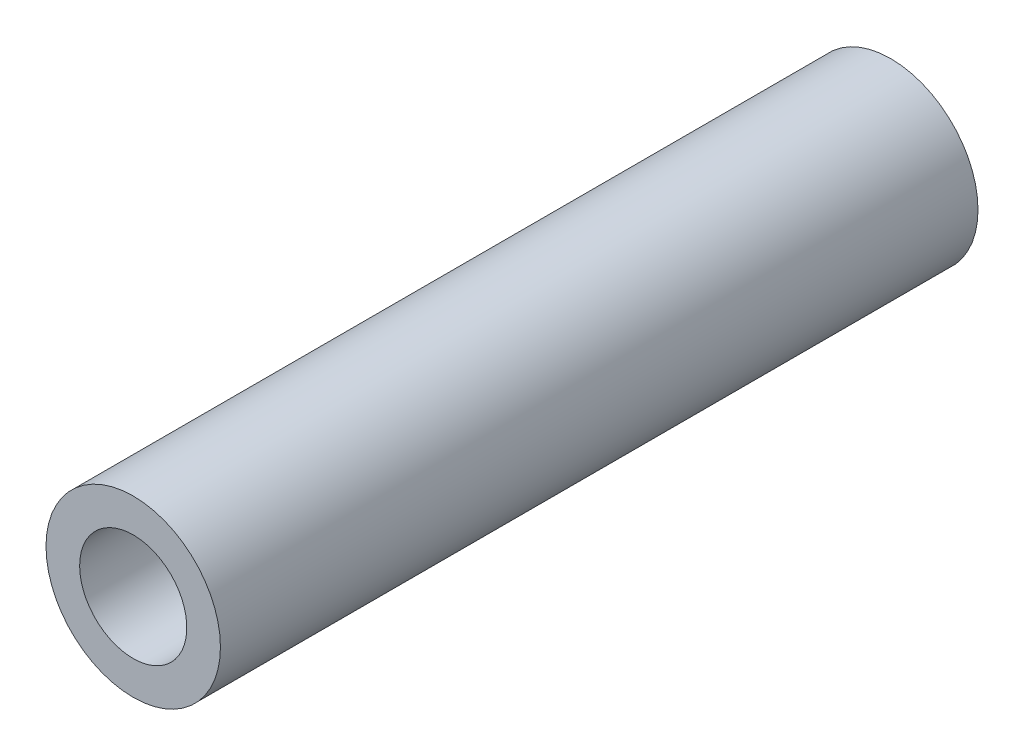
ISO-10303-21;
HEADER;
FILE_DESCRIPTION(('STEP AP214'),'2;1');
FILE_NAME('part.step','',(''),(''),'','','');
FILE_SCHEMA(('AUTOMOTIVE_DESIGN { 1 0 10303 214 1 1 1 1 }'));
ENDSEC;
DATA;
#1=APPLICATION_CONTEXT('core data for automotive mechanical design processes');
#2=APPLICATION_PROTOCOL_DEFINITION('international standard','automotive_design',2000,#1);
#3=PRODUCT_CONTEXT('',#1,'mechanical');
#4=PRODUCT('Part','Part','',(#3));
#5=PRODUCT_RELATED_PRODUCT_CATEGORY('part','',(#4));
#6=PRODUCT_DEFINITION_FORMATION('','',#4);
#7=PRODUCT_DEFINITION_CONTEXT('part definition',#1,'design');
#8=PRODUCT_DEFINITION('design','',#6,#7);
#9=PRODUCT_DEFINITION_SHAPE('','',#8);
#10=(LENGTH_UNIT() NAMED_UNIT(*) SI_UNIT(.MILLI.,.METRE.));
#11=(NAMED_UNIT(*) PLANE_ANGLE_UNIT() SI_UNIT($,.RADIAN.));
#12=(NAMED_UNIT(*) SI_UNIT($,.STERADIAN.) SOLID_ANGLE_UNIT());
#13=UNCERTAINTY_MEASURE_WITH_UNIT(LENGTH_MEASURE(1.E-05),#10,'distance_accuracy_value','');
#14=(GEOMETRIC_REPRESENTATION_CONTEXT(3) GLOBAL_UNCERTAINTY_ASSIGNED_CONTEXT((#13)) GLOBAL_UNIT_ASSIGNED_CONTEXT((#10,
#11,#12)) REPRESENTATION_CONTEXT('',''));
#15=CARTESIAN_POINT('',(0.,0.,0.));
#16=DIRECTION('',(0.,0.,1.));
#17=DIRECTION('',(1.,0.,0.));
#18=AXIS2_PLACEMENT_3D('',#15,#16,#17);
#19=CARTESIAN_POINT('',(0.,0.,30.4));
#20=DIRECTION('',(0.,0.,1.));
#21=DIRECTION('',(1.,0.,0.));
#22=AXIS2_PLACEMENT_3D('',#19,#20,#21);
#23=PLANE('',#22);
#24=CARTESIAN_POINT('',(0.,0.,30.4));
#25=DIRECTION('',(0.,0.,1.));
#26=DIRECTION('',(1.,0.,0.));
#27=AXIS2_PLACEMENT_3D('',#24,#25,#26);
#28=CIRCLE('',#27,3.5);
#29=CARTESIAN_POINT('',(-3.5,0.,30.4));
#30=VERTEX_POINT('',#29);
#31=EDGE_CURVE('E10',#30,#30,#28,.T.);
#32=ORIENTED_EDGE('',*,*,#31,.T.);
#33=EDGE_LOOP('',(#32));
#34=FACE_BOUND('',#33,.T.);
#35=CARTESIAN_POINT('',(0.,0.,30.4));
#36=DIRECTION('',(0.,0.,1.));
#37=DIRECTION('',(1.,0.,0.));
#38=AXIS2_PLACEMENT_3D('',#35,#36,#37);
#39=CIRCLE('',#38,2.15);
#40=CARTESIAN_POINT('',(-2.15,0.,30.4));
#41=VERTEX_POINT('',#40);
#42=EDGE_CURVE('E48',#41,#41,#39,.T.);
#43=ORIENTED_EDGE('',*,*,#42,.F.);
#44=EDGE_LOOP('',(#43));
#45=FACE_BOUND('',#44,.T.);
#46=ADVANCED_FACE('F37',(#34,#45),#23,.T.);
#47=CARTESIAN_POINT('',(0.,0.,0.));
#48=DIRECTION('',(0.,0.,1.));
#49=DIRECTION('',(1.,0.,0.));
#50=AXIS2_PLACEMENT_3D('',#47,#48,#49);
#51=PLANE('',#50);
#52=CARTESIAN_POINT('',(0.,0.,0.));
#53=DIRECTION('',(0.,0.,1.));
#54=DIRECTION('',(1.,0.,0.));
#55=AXIS2_PLACEMENT_3D('',#52,#53,#54);
#56=CIRCLE('',#55,3.5);
#57=CARTESIAN_POINT('',(-3.5,0.,0.));
#58=VERTEX_POINT('',#57);
#59=EDGE_CURVE('E41',#58,#58,#56,.T.);
#60=ORIENTED_EDGE('',*,*,#59,.F.);
#61=EDGE_LOOP('',(#60));
#62=FACE_BOUND('',#61,.T.);
#63=CARTESIAN_POINT('',(0.,0.,0.));
#64=DIRECTION('',(0.,0.,1.));
#65=DIRECTION('',(1.,0.,0.));
#66=AXIS2_PLACEMENT_3D('',#63,#64,#65);
#67=CIRCLE('',#66,2.15);
#68=CARTESIAN_POINT('',(-2.15,0.,0.));
#69=VERTEX_POINT('',#68);
#70=EDGE_CURVE('E50',#69,#69,#67,.T.);
#71=ORIENTED_EDGE('',*,*,#70,.T.);
#72=EDGE_LOOP('',(#71));
#73=FACE_BOUND('',#72,.T.);
#74=ADVANCED_FACE('F60',(#62,#73),#51,.F.);
#75=CARTESIAN_POINT('',(0.,0.,30.4));
#76=DIRECTION('',(0.,0.,-1.));
#77=DIRECTION('',(-1.,0.,0.));
#78=AXIS2_PLACEMENT_3D('',#75,#76,#77);
#79=CYLINDRICAL_SURFACE('',#78,3.5);
#80=CARTESIAN_POINT('',(-3.5,0.,30.4));
#81=CARTESIAN_POINT('',(-3.5,0.,30.0833333333333));
#82=CARTESIAN_POINT('',(-3.5,0.,29.7666666666667));
#83=CARTESIAN_POINT('',(-3.5,0.,29.1333333333333));
#84=CARTESIAN_POINT('',(-3.5,0.,28.8166666666667));
#85=CARTESIAN_POINT('',(-3.5,0.,28.1833333333333));
#86=CARTESIAN_POINT('',(-3.5,0.,27.8666666666667));
#87=CARTESIAN_POINT('',(-3.5,0.,27.2333333333333));
#88=CARTESIAN_POINT('',(-3.5,0.,26.9166666666667));
#89=CARTESIAN_POINT('',(-3.5,0.,26.2833333333333));
#90=CARTESIAN_POINT('',(-3.5,0.,25.9666666666667));
#91=CARTESIAN_POINT('',(-3.5,0.,25.3333333333333));
#92=CARTESIAN_POINT('',(-3.5,0.,25.0166666666667));
#93=CARTESIAN_POINT('',(-3.5,0.,24.3833333333333));
#94=CARTESIAN_POINT('',(-3.5,0.,24.0666666666667));
#95=CARTESIAN_POINT('',(-3.5,0.,23.4333333333333));
#96=CARTESIAN_POINT('',(-3.5,0.,23.1166666666667));
#97=CARTESIAN_POINT('',(-3.5,0.,22.4833333333333));
#98=CARTESIAN_POINT('',(-3.5,0.,22.1666666666667));
#99=CARTESIAN_POINT('',(-3.5,0.,21.5333333333333));
#100=CARTESIAN_POINT('',(-3.5,0.,21.2166666666667));
#101=CARTESIAN_POINT('',(-3.5,0.,20.5833333333333));
#102=CARTESIAN_POINT('',(-3.5,0.,20.2666666666667));
#103=CARTESIAN_POINT('',(-3.5,0.,19.6333333333333));
#104=CARTESIAN_POINT('',(-3.5,0.,19.3166666666667));
#105=CARTESIAN_POINT('',(-3.5,0.,18.6833333333333));
#106=CARTESIAN_POINT('',(-3.5,0.,18.3666666666667));
#107=CARTESIAN_POINT('',(-3.5,0.,17.7333333333333));
#108=CARTESIAN_POINT('',(-3.5,0.,17.4166666666667));
#109=CARTESIAN_POINT('',(-3.5,0.,16.7833333333333));
#110=CARTESIAN_POINT('',(-3.5,0.,16.4666666666667));
#111=CARTESIAN_POINT('',(-3.5,0.,15.8333333333333));
#112=CARTESIAN_POINT('',(-3.5,0.,15.5166666666667));
#113=CARTESIAN_POINT('',(-3.5,0.,14.8833333333333));
#114=CARTESIAN_POINT('',(-3.5,0.,14.5666666666667));
#115=CARTESIAN_POINT('',(-3.5,0.,13.9333333333333));
#116=CARTESIAN_POINT('',(-3.5,0.,13.6166666666667));
#117=CARTESIAN_POINT('',(-3.5,0.,12.9833333333333));
#118=CARTESIAN_POINT('',(-3.5,0.,12.6666666666667));
#119=CARTESIAN_POINT('',(-3.5,0.,12.0333333333333));
#120=CARTESIAN_POINT('',(-3.5,0.,11.7166666666667));
#121=CARTESIAN_POINT('',(-3.5,0.,11.0833333333333));
#122=CARTESIAN_POINT('',(-3.5,0.,10.7666666666667));
#123=CARTESIAN_POINT('',(-3.5,0.,10.1333333333333));
#124=CARTESIAN_POINT('',(-3.5,0.,9.81666666666667));
#125=CARTESIAN_POINT('',(-3.5,0.,9.18333333333334));
#126=CARTESIAN_POINT('',(-3.5,0.,8.86666666666667));
#127=CARTESIAN_POINT('',(-3.5,0.,8.23333333333334));
#128=CARTESIAN_POINT('',(-3.5,0.,7.91666666666667));
#129=CARTESIAN_POINT('',(-3.5,0.,7.28333333333333));
#130=CARTESIAN_POINT('',(-3.5,0.,6.96666666666667));
#131=CARTESIAN_POINT('',(-3.5,0.,6.33333333333333));
#132=CARTESIAN_POINT('',(-3.5,0.,6.01666666666667));
#133=CARTESIAN_POINT('',(-3.5,0.,5.38333333333333));
#134=CARTESIAN_POINT('',(-3.5,0.,5.06666666666667));
#135=CARTESIAN_POINT('',(-3.5,0.,4.43333333333333));
#136=CARTESIAN_POINT('',(-3.5,0.,4.11666666666667));
#137=CARTESIAN_POINT('',(-3.5,0.,3.48333333333333));
#138=CARTESIAN_POINT('',(-3.5,0.,3.16666666666667));
#139=CARTESIAN_POINT('',(-3.5,0.,2.53333333333333));
#140=CARTESIAN_POINT('',(-3.5,0.,2.21666666666667));
#141=CARTESIAN_POINT('',(-3.5,0.,1.58333333333333));
#142=CARTESIAN_POINT('',(-3.5,0.,1.26666666666667));
#143=CARTESIAN_POINT('',(-3.5,0.,0.633333333333333));
#144=CARTESIAN_POINT('',(-3.5,0.,0.316666666666666));
#145=CARTESIAN_POINT('',(-3.5,0.,0.));
#146=B_SPLINE_CURVE_WITH_KNOTS('',3,(#80,#81,#82,#83,#84,#85,#86,#87,#88,#89,#90,#91,#92,#93,
#94,#95,#96,#97,#98,#99,#100,#101,#102,#103,#104,#105,#106,#107,#108,#109,#110,#111,#112,#113,
#114,#115,#116,#117,#118,#119,#120,#121,#122,#123,#124,#125,#126,#127,#128,#129,#130,#131,#132,
#133,#134,#135,#136,#137,#138,#139,#140,#141,#142,#143,#144,#145),.UNSPECIFIED.,.F.,.F.,(4,2,2,
2,2,2,2,2,2,2,2,2,2,2,2,2,2,2,2,2,2,2,2,2,2,2,2,2,2,2,2,2,4),(0.,0.950000000000003,1.9,2.85,3.8,
4.75,5.7,6.65,7.6,8.55,9.5,10.45,11.4,12.35,13.3,14.25,15.2,16.15,17.1,18.05,19.,19.95,20.9,
21.85,22.8,23.75,24.7,25.65,26.6,27.55,28.5,29.45,30.4),.UNSPECIFIED.);
#147=EDGE_CURVE('BSEAM39',#30,#58,#146,.T.);
#148=ORIENTED_EDGE('',*,*,#31,.F.);
#149=ORIENTED_EDGE('',*,*,#59,.T.);
#150=ORIENTED_EDGE('',*,*,#147,.T.);
#151=ORIENTED_EDGE('',*,*,#147,.F.);
#152=EDGE_LOOP('',(#148,#150,#149,#151));
#153=FACE_BOUND('',#152,.T.);
#154=ADVANCED_FACE('F39',(#153),#79,.T.);
#155=CARTESIAN_POINT('',(0.,0.,30.4));
#156=DIRECTION('',(0.,0.,-1.));
#157=DIRECTION('',(-1.,0.,0.));
#158=AXIS2_PLACEMENT_3D('',#155,#156,#157);
#159=CYLINDRICAL_SURFACE('',#158,2.15);
#160=CARTESIAN_POINT('',(-2.15,0.,30.4));
#161=CARTESIAN_POINT('',(-2.15,0.,30.0833333333333));
#162=CARTESIAN_POINT('',(-2.15,0.,29.7666666666667));
#163=CARTESIAN_POINT('',(-2.15,0.,29.1333333333333));
#164=CARTESIAN_POINT('',(-2.15,0.,28.8166666666667));
#165=CARTESIAN_POINT('',(-2.15,0.,28.1833333333333));
#166=CARTESIAN_POINT('',(-2.15,0.,27.8666666666667));
#167=CARTESIAN_POINT('',(-2.15,0.,27.2333333333333));
#168=CARTESIAN_POINT('',(-2.15,0.,26.9166666666667));
#169=CARTESIAN_POINT('',(-2.15,0.,26.2833333333333));
#170=CARTESIAN_POINT('',(-2.15,0.,25.9666666666667));
#171=CARTESIAN_POINT('',(-2.15,0.,25.3333333333333));
#172=CARTESIAN_POINT('',(-2.15,0.,25.0166666666667));
#173=CARTESIAN_POINT('',(-2.15,0.,24.3833333333333));
#174=CARTESIAN_POINT('',(-2.15,0.,24.0666666666667));
#175=CARTESIAN_POINT('',(-2.15,0.,23.4333333333333));
#176=CARTESIAN_POINT('',(-2.15,0.,23.1166666666667));
#177=CARTESIAN_POINT('',(-2.15,0.,22.4833333333333));
#178=CARTESIAN_POINT('',(-2.15,0.,22.1666666666667));
#179=CARTESIAN_POINT('',(-2.15,0.,21.5333333333333));
#180=CARTESIAN_POINT('',(-2.15,0.,21.2166666666667));
#181=CARTESIAN_POINT('',(-2.15,0.,20.5833333333333));
#182=CARTESIAN_POINT('',(-2.15,0.,20.2666666666667));
#183=CARTESIAN_POINT('',(-2.15,0.,19.6333333333333));
#184=CARTESIAN_POINT('',(-2.15,0.,19.3166666666667));
#185=CARTESIAN_POINT('',(-2.15,0.,18.6833333333333));
#186=CARTESIAN_POINT('',(-2.15,0.,18.3666666666667));
#187=CARTESIAN_POINT('',(-2.15,0.,17.7333333333333));
#188=CARTESIAN_POINT('',(-2.15,0.,17.4166666666667));
#189=CARTESIAN_POINT('',(-2.15,0.,16.7833333333333));
#190=CARTESIAN_POINT('',(-2.15,0.,16.4666666666667));
#191=CARTESIAN_POINT('',(-2.15,0.,15.8333333333333));
#192=CARTESIAN_POINT('',(-2.15,0.,15.5166666666667));
#193=CARTESIAN_POINT('',(-2.15,0.,14.8833333333333));
#194=CARTESIAN_POINT('',(-2.15,0.,14.5666666666667));
#195=CARTESIAN_POINT('',(-2.15,0.,13.9333333333333));
#196=CARTESIAN_POINT('',(-2.15,0.,13.6166666666667));
#197=CARTESIAN_POINT('',(-2.15,0.,12.9833333333333));
#198=CARTESIAN_POINT('',(-2.15,0.,12.6666666666667));
#199=CARTESIAN_POINT('',(-2.15,0.,12.0333333333333));
#200=CARTESIAN_POINT('',(-2.15,0.,11.7166666666667));
#201=CARTESIAN_POINT('',(-2.15,0.,11.0833333333333));
#202=CARTESIAN_POINT('',(-2.15,0.,10.7666666666667));
#203=CARTESIAN_POINT('',(-2.15,0.,10.1333333333333));
#204=CARTESIAN_POINT('',(-2.15,0.,9.81666666666667));
#205=CARTESIAN_POINT('',(-2.15,0.,9.18333333333334));
#206=CARTESIAN_POINT('',(-2.15,0.,8.86666666666667));
#207=CARTESIAN_POINT('',(-2.15,0.,8.23333333333334));
#208=CARTESIAN_POINT('',(-2.15,0.,7.91666666666667));
#209=CARTESIAN_POINT('',(-2.15,0.,7.28333333333333));
#210=CARTESIAN_POINT('',(-2.15,0.,6.96666666666667));
#211=CARTESIAN_POINT('',(-2.15,0.,6.33333333333333));
#212=CARTESIAN_POINT('',(-2.15,0.,6.01666666666667));
#213=CARTESIAN_POINT('',(-2.15,0.,5.38333333333333));
#214=CARTESIAN_POINT('',(-2.15,0.,5.06666666666667));
#215=CARTESIAN_POINT('',(-2.15,0.,4.43333333333333));
#216=CARTESIAN_POINT('',(-2.15,0.,4.11666666666667));
#217=CARTESIAN_POINT('',(-2.15,0.,3.48333333333333));
#218=CARTESIAN_POINT('',(-2.15,0.,3.16666666666667));
#219=CARTESIAN_POINT('',(-2.15,0.,2.53333333333333));
#220=CARTESIAN_POINT('',(-2.15,0.,2.21666666666667));
#221=CARTESIAN_POINT('',(-2.15,0.,1.58333333333333));
#222=CARTESIAN_POINT('',(-2.15,0.,1.26666666666667));
#223=CARTESIAN_POINT('',(-2.15,0.,0.633333333333333));
#224=CARTESIAN_POINT('',(-2.15,0.,0.316666666666666));
#225=CARTESIAN_POINT('',(-2.15,0.,0.));
#226=B_SPLINE_CURVE_WITH_KNOTS('',3,(#160,#161,#162,#163,#164,#165,#166,#167,#168,#169,#170,
#171,#172,#173,#174,#175,#176,#177,#178,#179,#180,#181,#182,#183,#184,#185,#186,#187,#188,#189,
#190,#191,#192,#193,#194,#195,#196,#197,#198,#199,#200,#201,#202,#203,#204,#205,#206,#207,#208,
#209,#210,#211,#212,#213,#214,#215,#216,#217,#218,#219,#220,#221,#222,#223,#224,#225),
.UNSPECIFIED.,.F.,.F.,(4,2,2,2,2,2,2,2,2,2,2,2,2,2,2,2,2,2,2,2,2,2,2,2,2,2,2,2,2,2,2,2,4),(0.,
0.950000000000003,1.9,2.85,3.8,4.75,5.7,6.65,7.6,8.55,9.5,10.45,11.4,12.35,13.3,14.25,15.2,
16.15,17.1,18.05,19.,19.95,20.9,21.85,22.8,23.75,24.7,25.65,26.6,27.55,28.5,29.45,30.4),.UNSPECIFIED.);
#227=EDGE_CURVE('BSEAM56',#41,#69,#226,.T.);
#228=ORIENTED_EDGE('',*,*,#42,.T.);
#229=ORIENTED_EDGE('',*,*,#70,.F.);
#230=ORIENTED_EDGE('',*,*,#227,.T.);
#231=ORIENTED_EDGE('',*,*,#227,.F.);
#232=EDGE_LOOP('',(#228,#230,#229,#231));
#233=FACE_BOUND('',#232,.T.);
#234=ADVANCED_FACE('F56',(#233),#159,.F.);
#235=CLOSED_SHELL('',(#46,#74,#154,#234));
#236=MANIFOLD_SOLID_BREP('B2',#235);
#237=ADVANCED_BREP_SHAPE_REPRESENTATION('',(#18,#236),#14);
#238=SHAPE_DEFINITION_REPRESENTATION(#9,#237);
ENDSEC;
END-ISO-10303-21;
